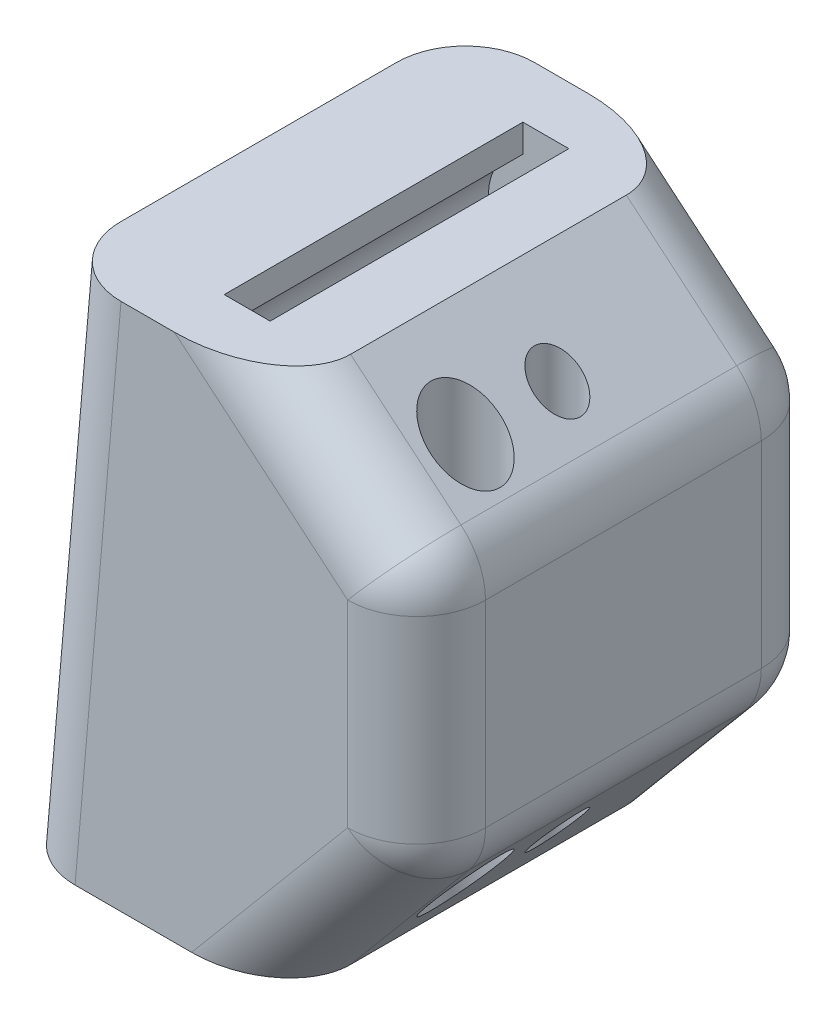
ISO-10303-21;
HEADER;
FILE_DESCRIPTION(('STEP AP214'),'2;1');
FILE_NAME('part.step','',(''),(''),'','','');
FILE_SCHEMA(('AUTOMOTIVE_DESIGN { 1 0 10303 214 1 1 1 1 }'));
ENDSEC;
DATA;
#1=APPLICATION_CONTEXT('core data for automotive mechanical design processes');
#2=APPLICATION_PROTOCOL_DEFINITION('international standard','automotive_design',2000,#1);
#3=PRODUCT_CONTEXT('',#1,'mechanical');
#4=PRODUCT('Part','Part','',(#3));
#5=PRODUCT_RELATED_PRODUCT_CATEGORY('part','',(#4));
#6=PRODUCT_DEFINITION_FORMATION('','',#4);
#7=PRODUCT_DEFINITION_CONTEXT('part definition',#1,'design');
#8=PRODUCT_DEFINITION('design','',#6,#7);
#9=PRODUCT_DEFINITION_SHAPE('','',#8);
#10=(LENGTH_UNIT() NAMED_UNIT(*) SI_UNIT(.MILLI.,.METRE.));
#11=(NAMED_UNIT(*) PLANE_ANGLE_UNIT() SI_UNIT($,.RADIAN.));
#12=(NAMED_UNIT(*) SI_UNIT($,.STERADIAN.) SOLID_ANGLE_UNIT());
#13=UNCERTAINTY_MEASURE_WITH_UNIT(LENGTH_MEASURE(1.E-05),#10,'distance_accuracy_value','');
#14=(GEOMETRIC_REPRESENTATION_CONTEXT(3) GLOBAL_UNCERTAINTY_ASSIGNED_CONTEXT((#13)) GLOBAL_UNIT_ASSIGNED_CONTEXT((#10,
#11,#12)) REPRESENTATION_CONTEXT('',''));
#15=CARTESIAN_POINT('',(0.,0.,0.));
#16=DIRECTION('',(0.,0.,1.));
#17=DIRECTION('',(1.,0.,0.));
#18=AXIS2_PLACEMENT_3D('',#15,#16,#17);
#19=CARTESIAN_POINT('',(0.,0.,18.));
#20=DIRECTION('',(0.,1.,0.));
#21=DIRECTION('',(0.,0.,1.));
#22=AXIS2_PLACEMENT_3D('',#19,#20,#21);
#23=PLANE('',#22);
#24=DIRECTION('',(1.,0.,0.));
#25=VECTOR('',#24,1.);
#26=CARTESIAN_POINT('',(0.,0.,0.));
#27=LINE('',#26,#25);
#28=CARTESIAN_POINT('',(3.0113207949431,0.,0.));
#29=VERTEX_POINT('',#28);
#30=CARTESIAN_POINT('',(8.08377813200317,0.,0.));
#31=VERTEX_POINT('',#30);
#32=EDGE_CURVE('E286',#29,#31,#27,.T.);
#33=ORIENTED_EDGE('',*,*,#32,.T.);
#34=CARTESIAN_POINT('',(8.08377813200317,0.,3.));
#35=DIRECTION('',(0.,1.,0.));
#36=DIRECTION('',(-1.,0.,0.));
#37=AXIS2_PLACEMENT_3D('',#34,#35,#36);
#38=ELLIPSE('',#37,3.91622186799683,3.);
#39=CARTESIAN_POINT('',(12.,0.,3.));
#40=VERTEX_POINT('',#39);
#41=EDGE_CURVE('E382',#31,#40,#38,.F.);
#42=ORIENTED_EDGE('',*,*,#41,.T.);
#43=DIRECTION('',(0.,0.,-1.));
#44=VECTOR('',#43,1.);
#45=CARTESIAN_POINT('',(12.,0.,18.));
#46=LINE('',#45,#44);
#47=CARTESIAN_POINT('',(12.,0.,15.));
#48=VERTEX_POINT('',#47);
#49=EDGE_CURVE('E336',#48,#40,#46,.T.);
#50=ORIENTED_EDGE('',*,*,#49,.F.);
#51=CARTESIAN_POINT('',(8.08377813200318,0.,15.));
#52=DIRECTION('',(0.,1.,0.));
#53=DIRECTION('',(1.,0.,0.));
#54=AXIS2_PLACEMENT_3D('',#51,#52,#53);
#55=ELLIPSE('',#54,3.91622186799683,3.);
#56=CARTESIAN_POINT('',(8.08377813200317,0.,18.));
#57=VERTEX_POINT('',#56);
#58=EDGE_CURVE('E379',#48,#57,#55,.F.);
#59=ORIENTED_EDGE('',*,*,#58,.T.);
#60=DIRECTION('',(1.,0.,0.));
#61=VECTOR('',#60,1.);
#62=CARTESIAN_POINT('',(0.,0.,18.));
#63=LINE('',#62,#61);
#64=CARTESIAN_POINT('',(3.01132079494309,0.,18.));
#65=VERTEX_POINT('',#64);
#66=EDGE_CURVE('E297',#65,#57,#63,.T.);
#67=ORIENTED_EDGE('',*,*,#66,.F.);
#68=CARTESIAN_POINT('',(3.01132079494309,0.,15.));
#69=DIRECTION('',(0.,1.,0.));
#70=DIRECTION('',(-1.,0.,0.));
#71=AXIS2_PLACEMENT_3D('',#68,#69,#70);
#72=ELLIPSE('',#71,3.01132079494309,3.);
#73=CARTESIAN_POINT('',(0.,0.,15.));
#74=VERTEX_POINT('',#73);
#75=EDGE_CURVE('E373',#65,#74,#72,.F.);
#76=ORIENTED_EDGE('',*,*,#75,.T.);
#77=DIRECTION('',(0.,0.,-1.));
#78=VECTOR('',#77,1.);
#79=CARTESIAN_POINT('',(0.,0.,18.));
#80=LINE('',#79,#78);
#81=CARTESIAN_POINT('',(0.,0.,3.));
#82=VERTEX_POINT('',#81);
#83=EDGE_CURVE('E340',#74,#82,#80,.T.);
#84=ORIENTED_EDGE('',*,*,#83,.T.);
#85=CARTESIAN_POINT('',(3.01132079494309,0.,3.));
#86=DIRECTION('',(0.,1.,0.));
#87=DIRECTION('',(1.,0.,0.));
#88=AXIS2_PLACEMENT_3D('',#85,#86,#87);
#89=ELLIPSE('',#88,3.01132079494309,3.);
#90=EDGE_CURVE('E376',#82,#29,#89,.F.);
#91=ORIENTED_EDGE('',*,*,#90,.T.);
#92=EDGE_LOOP('',(#33,#42,#50,#59,#67,#76,#84,#91));
#93=FACE_BOUND('',#92,.T.);
#94=DIRECTION('',(-1.,0.,0.));
#95=VECTOR('',#94,1.);
#96=CARTESIAN_POINT('',(9.,0.,15.5));
#97=LINE('',#96,#95);
#98=CARTESIAN_POINT('',(9.,0.,15.5));
#99=VERTEX_POINT('',#98);
#100=CARTESIAN_POINT('',(7.,0.,15.5));
#101=VERTEX_POINT('',#100);
#102=EDGE_CURVE('E215',#99,#101,#97,.T.);
#103=ORIENTED_EDGE('',*,*,#102,.F.);
#104=DIRECTION('',(0.,0.,-1.));
#105=VECTOR('',#104,1.);
#106=CARTESIAN_POINT('',(9.,0.,15.5));
#107=LINE('',#106,#105);
#108=CARTESIAN_POINT('',(9.,0.,2.5));
#109=VERTEX_POINT('',#108);
#110=EDGE_CURVE('E205',#99,#109,#107,.T.);
#111=ORIENTED_EDGE('',*,*,#110,.T.);
#112=DIRECTION('',(-1.,0.,0.));
#113=VECTOR('',#112,1.);
#114=CARTESIAN_POINT('',(9.,0.,2.5));
#115=LINE('',#114,#113);
#116=CARTESIAN_POINT('',(7.,0.,2.5));
#117=VERTEX_POINT('',#116);
#118=EDGE_CURVE('E224',#109,#117,#115,.T.);
#119=ORIENTED_EDGE('',*,*,#118,.T.);
#120=DIRECTION('',(0.,0.,-1.));
#121=VECTOR('',#120,1.);
#122=CARTESIAN_POINT('',(7.,0.,15.5));
#123=LINE('',#122,#121);
#124=EDGE_CURVE('E246',#101,#117,#123,.T.);
#125=ORIENTED_EDGE('',*,*,#124,.F.);
#126=EDGE_LOOP('',(#103,#111,#119,#125));
#127=FACE_BOUND('',#126,.T.);
#128=ADVANCED_FACE('F39',(#93,#127),#23,.F.);
#129=CARTESIAN_POINT('',(2.,23.,18.));
#130=DIRECTION('',(0.,-1.,0.));
#131=DIRECTION('',(0.,0.,-1.));
#132=AXIS2_PLACEMENT_3D('',#129,#130,#131);
#133=PLANE('',#132);
#134=DIRECTION('',(0.,0.,-1.));
#135=VECTOR('',#134,1.);
#136=CARTESIAN_POINT('',(12.,23.,18.));
#137=LINE('',#136,#135);
#138=CARTESIAN_POINT('',(12.,23.,15.));
#139=VERTEX_POINT('',#138);
#140=CARTESIAN_POINT('',(12.,23.,3.));
#141=VERTEX_POINT('',#140);
#142=EDGE_CURVE('E316',#139,#141,#137,.T.);
#143=ORIENTED_EDGE('',*,*,#142,.T.);
#144=CARTESIAN_POINT('',(7.33282851941877,23.,3.));
#145=DIRECTION('',(0.,-1.,0.));
#146=DIRECTION('',(1.,0.,0.));
#147=AXIS2_PLACEMENT_3D('',#144,#145,#146);
#148=ELLIPSE('',#147,4.66717148058123,3.);
#149=CARTESIAN_POINT('',(7.33282851941877,23.,0.));
#150=VERTEX_POINT('',#149);
#151=EDGE_CURVE('E406',#141,#150,#148,.F.);
#152=ORIENTED_EDGE('',*,*,#151,.T.);
#153=DIRECTION('',(-1.,0.,0.));
#154=VECTOR('',#153,1.);
#155=CARTESIAN_POINT('',(2.,23.,0.));
#156=LINE('',#155,#154);
#157=CARTESIAN_POINT('',(5.01132079494309,23.,0.));
#158=VERTEX_POINT('',#157);
#159=EDGE_CURVE('E302',#150,#158,#156,.T.);
#160=ORIENTED_EDGE('',*,*,#159,.T.);
#161=CARTESIAN_POINT('',(5.01132079494309,23.,3.));
#162=DIRECTION('',(0.,-1.,0.));
#163=DIRECTION('',(1.,0.,0.));
#164=AXIS2_PLACEMENT_3D('',#161,#162,#163);
#165=ELLIPSE('',#164,3.01132079494309,3.);
#166=CARTESIAN_POINT('',(2.,23.,3.));
#167=VERTEX_POINT('',#166);
#168=EDGE_CURVE('E400',#158,#167,#165,.F.);
#169=ORIENTED_EDGE('',*,*,#168,.T.);
#170=DIRECTION('',(0.,0.,-1.));
#171=VECTOR('',#170,1.);
#172=CARTESIAN_POINT('',(2.,23.,18.));
#173=LINE('',#172,#171);
#174=CARTESIAN_POINT('',(2.,23.,15.));
#175=VERTEX_POINT('',#174);
#176=EDGE_CURVE('E306',#175,#167,#173,.T.);
#177=ORIENTED_EDGE('',*,*,#176,.F.);
#178=CARTESIAN_POINT('',(5.01132079494309,23.,15.));
#179=DIRECTION('',(0.,-1.,0.));
#180=DIRECTION('',(-1.,0.,0.));
#181=AXIS2_PLACEMENT_3D('',#178,#179,#180);
#182=ELLIPSE('',#181,3.01132079494309,3.);
#183=CARTESIAN_POINT('',(5.01132079494309,23.,18.));
#184=VERTEX_POINT('',#183);
#185=EDGE_CURVE('E397',#175,#184,#182,.F.);
#186=ORIENTED_EDGE('',*,*,#185,.T.);
#187=DIRECTION('',(-1.,0.,0.));
#188=VECTOR('',#187,1.);
#189=CARTESIAN_POINT('',(2.,23.,18.));
#190=LINE('',#189,#188);
#191=CARTESIAN_POINT('',(7.33282851941877,23.,18.));
#192=VERTEX_POINT('',#191);
#193=EDGE_CURVE('E301',#192,#184,#190,.T.);
#194=ORIENTED_EDGE('',*,*,#193,.F.);
#195=CARTESIAN_POINT('',(7.33282851941877,23.,15.));
#196=DIRECTION('',(0.,-1.,0.));
#197=DIRECTION('',(-1.,0.,0.));
#198=AXIS2_PLACEMENT_3D('',#195,#196,#197);
#199=ELLIPSE('',#198,4.66717148058123,3.);
#200=EDGE_CURVE('E403',#192,#139,#199,.F.);
#201=ORIENTED_EDGE('',*,*,#200,.T.);
#202=EDGE_LOOP('',(#143,#152,#160,#169,#177,#186,#194,#201));
#203=FACE_BOUND('',#202,.T.);
#204=DIRECTION('',(-1.,0.,0.));
#205=VECTOR('',#204,1.);
#206=CARTESIAN_POINT('',(7.,23.,2.5));
#207=LINE('',#206,#205);
#208=CARTESIAN_POINT('',(9.,23.,2.5));
#209=VERTEX_POINT('',#208);
#210=CARTESIAN_POINT('',(7.,23.,2.5));
#211=VERTEX_POINT('',#210);
#212=EDGE_CURVE('E261',#209,#211,#207,.T.);
#213=ORIENTED_EDGE('',*,*,#212,.F.);
#214=DIRECTION('',(0.,0.,1.));
#215=VECTOR('',#214,1.);
#216=CARTESIAN_POINT('',(9.,23.,2.5));
#217=LINE('',#216,#215);
#218=CARTESIAN_POINT('',(9.,23.,15.5));
#219=VERTEX_POINT('',#218);
#220=EDGE_CURVE('E291',#209,#219,#217,.T.);
#221=ORIENTED_EDGE('',*,*,#220,.T.);
#222=DIRECTION('',(-1.,0.,0.));
#223=VECTOR('',#222,1.);
#224=CARTESIAN_POINT('',(7.,23.,15.5));
#225=LINE('',#224,#223);
#226=CARTESIAN_POINT('',(7.,23.,15.5));
#227=VERTEX_POINT('',#226);
#228=EDGE_CURVE('E276',#219,#227,#225,.T.);
#229=ORIENTED_EDGE('',*,*,#228,.T.);
#230=DIRECTION('',(0.,0.,1.));
#231=VECTOR('',#230,1.);
#232=CARTESIAN_POINT('',(7.,23.,2.5));
#233=LINE('',#232,#231);
#234=EDGE_CURVE('E287',#211,#227,#233,.T.);
#235=ORIENTED_EDGE('',*,*,#234,.F.);
#236=EDGE_LOOP('',(#213,#221,#229,#235));
#237=FACE_BOUND('',#236,.T.);
#238=ADVANCED_FACE('F474',(#203,#237),#133,.F.);
#239=CARTESIAN_POINT('',(0.,0.,18.));
#240=DIRECTION('',(0.996240588195683,-0.0866296163648419,0.));
#241=DIRECTION('',(0.0866296163648419,0.996240588195683,0.));
#242=AXIS2_PLACEMENT_3D('',#239,#240,#241);
#243=PLANE('',#242);
#244=ORIENTED_EDGE('',*,*,#176,.T.);
#245=DIRECTION('',(-0.0866296163648419,-0.996240588195683,0.));
#246=VECTOR('',#245,1.);
#247=CARTESIAN_POINT('',(0.,0.,3.));
#248=LINE('',#247,#246);
#249=EDGE_CURVE('E430',#167,#82,#248,.T.);
#250=ORIENTED_EDGE('',*,*,#249,.T.);
#251=ORIENTED_EDGE('',*,*,#83,.F.);
#252=DIRECTION('',(-0.0866296163648419,-0.996240588195683,0.));
#253=VECTOR('',#252,1.);
#254=CARTESIAN_POINT('',(0.,0.,15.));
#255=LINE('',#254,#253);
#256=EDGE_CURVE('E427',#74,#175,#255,.F.);
#257=ORIENTED_EDGE('',*,*,#256,.T.);
#258=EDGE_LOOP('',(#244,#250,#251,#257));
#259=FACE_BOUND('',#258,.T.);
#260=ADVANCED_FACE('F508',(#259),#243,.F.);
#261=CARTESIAN_POINT('',(12.,0.,18.));
#262=DIRECTION('',(-0.76604444311898,0.642787609686537,0.));
#263=DIRECTION('',(-0.642787609686537,-0.76604444311898,0.));
#264=AXIS2_PLACEMENT_3D('',#261,#262,#263);
#265=PLANE('',#264);
#266=CARTESIAN_POINT('',(15.,3.57526077778265,9.));
#267=DIRECTION('',(-0.76604444311898,0.642787609686537,0.));
#268=DIRECTION('',(-0.642787609686537,-0.76604444311898,0.));
#269=AXIS2_PLACEMENT_3D('',#266,#267,#268);
#270=ELLIPSE('',#269,1.55572382686042,1.);
#271=CARTESIAN_POINT('',(14.,2.38350718518843,9.));
#272=VERTEX_POINT('',#271);
#273=EDGE_CURVE('E227',#272,#272,#270,.F.);
#274=ORIENTED_EDGE('',*,*,#273,.F.);
#275=EDGE_LOOP('',(#274));
#276=FACE_BOUND('',#275,.T.);
#277=CARTESIAN_POINT('',(15.,3.57526077778265,13.));
#278=DIRECTION('',(-0.76604444311898,0.642787609686537,0.));
#279=DIRECTION('',(-0.642787609686537,-0.76604444311898,0.));
#280=AXIS2_PLACEMENT_3D('',#277,#278,#279);
#281=ELLIPSE('',#280,2.33358574029063,1.5);
#282=CARTESIAN_POINT('',(13.5,1.78763038889132,13.));
#283=VERTEX_POINT('',#282);
#284=EDGE_CURVE('E349',#283,#283,#281,.F.);
#285=ORIENTED_EDGE('',*,*,#284,.F.);
#286=EDGE_LOOP('',(#285));
#287=FACE_BOUND('',#286,.T.);
#288=ORIENTED_EDGE('',*,*,#49,.T.);
#289=DIRECTION('',(0.642787609686537,0.76604444311898,0.));
#290=VECTOR('',#289,1.);
#291=CARTESIAN_POINT('',(17.1718307475979,6.16354787373898,3.));
#292=LINE('',#291,#290);
#293=CARTESIAN_POINT('',(17.1718307475979,6.16354787373898,3.));
#294=VERTEX_POINT('',#293);
#295=EDGE_CURVE('E357',#40,#294,#292,.T.);
#296=ORIENTED_EDGE('',*,*,#295,.T.);
#297=DIRECTION('',(0.,0.,-1.));
#298=VECTOR('',#297,1.);
#299=CARTESIAN_POINT('',(17.1718307475979,6.16354787373898,18.));
#300=LINE('',#299,#298);
#301=CARTESIAN_POINT('',(17.1718307475979,6.16354787373898,15.));
#302=VERTEX_POINT('',#301);
#303=EDGE_CURVE('E332',#302,#294,#300,.T.);
#304=ORIENTED_EDGE('',*,*,#303,.F.);
#305=DIRECTION('',(0.642787609686537,0.76604444311898,0.));
#306=VECTOR('',#305,1.);
#307=CARTESIAN_POINT('',(12.,0.,15.));
#308=LINE('',#307,#306);
#309=EDGE_CURVE('E344',#302,#48,#308,.F.);
#310=ORIENTED_EDGE('',*,*,#309,.T.);
#311=EDGE_LOOP('',(#288,#296,#304,#310));
#312=FACE_BOUND('',#311,.T.);
#313=ADVANCED_FACE('F512',(#276,#287,#312),#265,.F.);
#314=CARTESIAN_POINT('',(14.8736974182409,8.0919107027986,18.));
#315=DIRECTION('',(0.,0.,-1.));
#316=DIRECTION('',(-1.,0.,0.));
#317=AXIS2_PLACEMENT_3D('',#314,#315,#316);
#318=CYLINDRICAL_SURFACE('',#317,3.);
#319=ORIENTED_EDGE('',*,*,#303,.T.);
#320=CARTESIAN_POINT('',(14.8736974182409,8.0919107027986,3.));
#321=DIRECTION('',(0.,0.,-1.));
#322=DIRECTION('',(-1.,0.,0.));
#323=AXIS2_PLACEMENT_3D('',#320,#321,#322);
#324=CIRCLE('',#323,3.);
#325=CARTESIAN_POINT('',(17.8736974182409,8.0919107027986,3.));
#326=VERTEX_POINT('',#325);
#327=EDGE_CURVE('E388',#294,#326,#324,.F.);
#328=ORIENTED_EDGE('',*,*,#327,.T.);
#329=DIRECTION('',(0.,0.,-1.));
#330=VECTOR('',#329,1.);
#331=CARTESIAN_POINT('',(17.8736974182409,8.0919107027986,18.));
#332=LINE('',#331,#330);
#333=CARTESIAN_POINT('',(17.8736974182409,8.0919107027986,15.));
#334=VERTEX_POINT('',#333);
#335=EDGE_CURVE('E328',#334,#326,#332,.T.);
#336=ORIENTED_EDGE('',*,*,#335,.F.);
#337=CARTESIAN_POINT('',(14.8736974182409,8.0919107027986,15.));
#338=DIRECTION('',(0.,0.,-1.));
#339=DIRECTION('',(-1.,0.,0.));
#340=AXIS2_PLACEMENT_3D('',#337,#338,#339);
#341=CIRCLE('',#340,3.);
#342=EDGE_CURVE('E385',#334,#302,#341,.T.);
#343=ORIENTED_EDGE('',*,*,#342,.T.);
#344=EDGE_LOOP('',(#319,#328,#336,#343));
#345=FACE_BOUND('',#344,.T.);
#346=ADVANCED_FACE('F764',(#345),#318,.T.);
#347=CARTESIAN_POINT('',(17.8736974182409,16.6724596882421,18.));
#348=DIRECTION('',(-1.,0.,0.));
#349=DIRECTION('',(0.,0.,1.));
#350=AXIS2_PLACEMENT_3D('',#347,#348,#349);
#351=PLANE('',#350);
#352=ORIENTED_EDGE('',*,*,#335,.T.);
#353=DIRECTION('',(0.,1.,0.));
#354=VECTOR('',#353,1.);
#355=CARTESIAN_POINT('',(17.8736974182409,16.6724596882421,3.));
#356=LINE('',#355,#354);
#357=CARTESIAN_POINT('',(17.8736974182409,16.6724596882421,3.));
#358=VERTEX_POINT('',#357);
#359=EDGE_CURVE('E11',#326,#358,#356,.T.);
#360=ORIENTED_EDGE('',*,*,#359,.T.);
#361=DIRECTION('',(0.,0.,-1.));
#362=VECTOR('',#361,1.);
#363=CARTESIAN_POINT('',(17.8736974182409,16.6724596882421,18.));
#364=LINE('',#363,#362);
#365=CARTESIAN_POINT('',(17.8736974182409,16.6724596882421,15.));
#366=VERTEX_POINT('',#365);
#367=EDGE_CURVE('E324',#366,#358,#364,.T.);
#368=ORIENTED_EDGE('',*,*,#367,.F.);
#369=DIRECTION('',(0.,1.,0.));
#370=VECTOR('',#369,1.);
#371=CARTESIAN_POINT('',(17.8736974182409,16.6724596882421,15.));
#372=LINE('',#371,#370);
#373=EDGE_CURVE('E49',#366,#334,#372,.F.);
#374=ORIENTED_EDGE('',*,*,#373,.T.);
#375=EDGE_LOOP('',(#352,#360,#368,#374));
#376=FACE_BOUND('',#375,.T.);
#377=ADVANCED_FACE('F755',(#376),#351,.F.);
#378=CARTESIAN_POINT('',(14.8736974182409,16.6724596882421,18.));
#379=DIRECTION('',(0.,0.,-1.));
#380=DIRECTION('',(-1.,0.,0.));
#381=AXIS2_PLACEMENT_3D('',#378,#379,#380);
#382=CYLINDRICAL_SURFACE('',#381,3.);
#383=ORIENTED_EDGE('',*,*,#367,.T.);
#384=CARTESIAN_POINT('',(14.8736974182409,16.6724596882421,3.));
#385=DIRECTION('',(0.,0.,-1.));
#386=DIRECTION('',(-1.,0.,0.));
#387=AXIS2_PLACEMENT_3D('',#384,#385,#386);
#388=CIRCLE('',#387,3.);
#389=CARTESIAN_POINT('',(16.8020602473005,18.970593017599,3.));
#390=VERTEX_POINT('',#389);
#391=EDGE_CURVE('E412',#358,#390,#388,.F.);
#392=ORIENTED_EDGE('',*,*,#391,.T.);
#393=DIRECTION('',(0.,0.,-1.));
#394=VECTOR('',#393,1.);
#395=CARTESIAN_POINT('',(16.8020602473005,18.970593017599,18.));
#396=LINE('',#395,#394);
#397=CARTESIAN_POINT('',(16.8020602473005,18.970593017599,15.));
#398=VERTEX_POINT('',#397);
#399=EDGE_CURVE('E320',#398,#390,#396,.T.);
#400=ORIENTED_EDGE('',*,*,#399,.F.);
#401=CARTESIAN_POINT('',(14.8736974182409,16.6724596882421,15.));
#402=DIRECTION('',(0.,0.,-1.));
#403=DIRECTION('',(-1.,0.,0.));
#404=AXIS2_PLACEMENT_3D('',#401,#402,#403);
#405=CIRCLE('',#404,3.);
#406=EDGE_CURVE('E409',#398,#366,#405,.T.);
#407=ORIENTED_EDGE('',*,*,#406,.T.);
#408=EDGE_LOOP('',(#383,#392,#400,#407));
#409=FACE_BOUND('',#408,.T.);
#410=ADVANCED_FACE('F746',(#409),#382,.T.);
#411=CARTESIAN_POINT('',(12.,23.,18.));
#412=DIRECTION('',(-0.64278760968654,-0.766044443118977,0.));
#413=DIRECTION('',(0.766044443118977,-0.64278760968654,0.));
#414=AXIS2_PLACEMENT_3D('',#411,#412,#413);
#415=PLANE('',#414);
#416=CARTESIAN_POINT('',(15.,20.4827011064682,9.));
#417=DIRECTION('',(-0.64278760968654,-0.766044443118977,0.));
#418=DIRECTION('',(0.766044443118977,-0.64278760968654,0.));
#419=AXIS2_PLACEMENT_3D('',#416,#417,#418);
#420=ELLIPSE('',#419,1.30540728933228,1.);
#421=CARTESIAN_POINT('',(16.,19.6436014752909,9.));
#422=VERTEX_POINT('',#421);
#423=EDGE_CURVE('E351',#422,#422,#420,.F.);
#424=ORIENTED_EDGE('',*,*,#423,.F.);
#425=EDGE_LOOP('',(#424));
#426=FACE_BOUND('',#425,.T.);
#427=CARTESIAN_POINT('',(15.,20.4827011064682,13.));
#428=DIRECTION('',(-0.64278760968654,-0.766044443118977,0.));
#429=DIRECTION('',(0.766044443118977,-0.64278760968654,0.));
#430=AXIS2_PLACEMENT_3D('',#427,#428,#429);
#431=ELLIPSE('',#430,1.95811093399842,1.5);
#432=CARTESIAN_POINT('',(16.5,19.2240516597022,13.));
#433=VERTEX_POINT('',#432);
#434=EDGE_CURVE('E345',#433,#433,#431,.F.);
#435=ORIENTED_EDGE('',*,*,#434,.F.);
#436=EDGE_LOOP('',(#435));
#437=FACE_BOUND('',#436,.T.);
#438=ORIENTED_EDGE('',*,*,#399,.T.);
#439=DIRECTION('',(-0.766044443118977,0.64278760968654,0.));
#440=VECTOR('',#439,1.);
#441=CARTESIAN_POINT('',(12.,23.,3.));
#442=LINE('',#441,#440);
#443=EDGE_CURVE('E394',#390,#141,#442,.T.);
#444=ORIENTED_EDGE('',*,*,#443,.T.);
#445=ORIENTED_EDGE('',*,*,#142,.F.);
#446=DIRECTION('',(-0.766044443118977,0.64278760968654,0.));
#447=VECTOR('',#446,1.);
#448=CARTESIAN_POINT('',(12.,23.,15.));
#449=LINE('',#448,#447);
#450=EDGE_CURVE('E391',#139,#398,#449,.F.);
#451=ORIENTED_EDGE('',*,*,#450,.T.);
#452=EDGE_LOOP('',(#438,#444,#445,#451));
#453=FACE_BOUND('',#452,.T.);
#454=ADVANCED_FACE('F738',(#426,#437,#453),#415,.F.);
#455=CARTESIAN_POINT('',(14.8736974182409,16.6724596882421,18.));
#456=DIRECTION('',(0.,0.,-1.));
#457=DIRECTION('',(-1.,0.,0.));
#458=AXIS2_PLACEMENT_3D('',#455,#456,#457);
#459=PLANE('',#458);
#460=ORIENTED_EDGE('',*,*,#193,.T.);
#461=DIRECTION('',(-0.0866296163648419,-0.996240588195683,0.));
#462=VECTOR('',#461,1.);
#463=CARTESIAN_POINT('',(4.53924321924389,17.5711078794592,18.));
#464=LINE('',#463,#462);
#465=EDGE_CURVE('E423',#184,#65,#464,.T.);
#466=ORIENTED_EDGE('',*,*,#465,.T.);
#467=ORIENTED_EDGE('',*,*,#66,.T.);
#468=DIRECTION('',(0.642787609686537,0.76604444311898,0.));
#469=VECTOR('',#468,1.);
#470=CARTESIAN_POINT('',(19.0987930012238,13.1271835428724,18.));
#471=LINE('',#470,#469);
#472=CARTESIAN_POINT('',(14.8736974182409,8.0919107027986,18.));
#473=VERTEX_POINT('',#472);
#474=EDGE_CURVE('E420',#57,#473,#471,.T.);
#475=ORIENTED_EDGE('',*,*,#474,.T.);
#476=DIRECTION('',(0.,1.,0.));
#477=VECTOR('',#476,1.);
#478=CARTESIAN_POINT('',(14.8736974182409,16.6724596882421,18.));
#479=LINE('',#478,#477);
#480=CARTESIAN_POINT('',(14.8736974182409,16.6724596882421,18.));
#481=VERTEX_POINT('',#480);
#482=EDGE_CURVE('E57',#473,#481,#479,.T.);
#483=ORIENTED_EDGE('',*,*,#482,.T.);
#484=DIRECTION('',(-0.766044443118977,0.64278760968654,0.));
#485=VECTOR('',#484,1.);
#486=CARTESIAN_POINT('',(14.8736974182409,16.6724596882421,18.));
#487=LINE('',#486,#485);
#488=EDGE_CURVE('E417',#481,#192,#487,.T.);
#489=ORIENTED_EDGE('',*,*,#488,.T.);
#490=EDGE_LOOP('',(#460,#466,#467,#475,#483,#489));
#491=FACE_BOUND('',#490,.T.);
#492=ADVANCED_FACE('F471',(#491),#459,.F.);
#493=CARTESIAN_POINT('',(14.8736974182409,16.6724596882421,0.));
#494=DIRECTION('',(0.,0.,-1.));
#495=DIRECTION('',(-1.,0.,0.));
#496=AXIS2_PLACEMENT_3D('',#493,#494,#495);
#497=PLANE('',#496);
#498=ORIENTED_EDGE('',*,*,#32,.F.);
#499=DIRECTION('',(-0.0866296163648419,-0.996240588195683,0.));
#500=VECTOR('',#499,1.);
#501=CARTESIAN_POINT('',(4.98872176458705,22.7401111509055,0.));
#502=LINE('',#501,#500);
#503=EDGE_CURVE('E370',#29,#158,#502,.F.);
#504=ORIENTED_EDGE('',*,*,#503,.T.);
#505=ORIENTED_EDGE('',*,*,#159,.F.);
#506=DIRECTION('',(-0.766044443118977,0.64278760968654,0.));
#507=VECTOR('',#506,1.);
#508=CARTESIAN_POINT('',(14.8736974182409,16.6724596882421,0.));
#509=LINE('',#508,#507);
#510=CARTESIAN_POINT('',(14.8736974182409,16.6724596882421,0.));
#511=VERTEX_POINT('',#510);
#512=EDGE_CURVE('E364',#150,#511,#509,.F.);
#513=ORIENTED_EDGE('',*,*,#512,.T.);
#514=DIRECTION('',(0.,1.,0.));
#515=VECTOR('',#514,1.);
#516=CARTESIAN_POINT('',(14.8736974182409,8.0919107027986,0.));
#517=LINE('',#516,#515);
#518=CARTESIAN_POINT('',(14.8736974182409,8.0919107027986,0.));
#519=VERTEX_POINT('',#518);
#520=EDGE_CURVE('E361',#511,#519,#517,.F.);
#521=ORIENTED_EDGE('',*,*,#520,.T.);
#522=DIRECTION('',(0.642787609686537,0.76604444311898,0.));
#523=VECTOR('',#522,1.);
#524=CARTESIAN_POINT('',(9.70186667064306,1.92836282905961,0.));
#525=LINE('',#524,#523);
#526=EDGE_CURVE('E367',#519,#31,#525,.F.);
#527=ORIENTED_EDGE('',*,*,#526,.T.);
#528=EDGE_LOOP('',(#498,#504,#505,#513,#521,#527));
#529=FACE_BOUND('',#528,.T.);
#530=ADVANCED_FACE('F717',(#529),#497,.T.);
#531=CARTESIAN_POINT('',(8.,19.5,2.5));
#532=DIRECTION('',(0.,0.,1.));
#533=DIRECTION('',(1.,0.,0.));
#534=AXIS2_PLACEMENT_3D('',#531,#532,#533);
#535=CYLINDRICAL_SURFACE('',#534,2.5);
#536=CARTESIAN_POINT('',(8.,19.5,15.5));
#537=DIRECTION('',(0.,0.,1.));
#538=DIRECTION('',(1.,0.,0.));
#539=AXIS2_PLACEMENT_3D('',#536,#537,#538);
#540=CIRCLE('',#539,2.5);
#541=CARTESIAN_POINT('',(7.,21.7912878474779,15.5));
#542=VERTEX_POINT('',#541);
#543=CARTESIAN_POINT('',(9.,21.7912878474779,15.5));
#544=VERTEX_POINT('',#543);
#545=EDGE_CURVE('E245',#542,#544,#540,.T.);
#546=ORIENTED_EDGE('',*,*,#545,.T.);
#547=DIRECTION('',(0.,0.,1.));
#548=VECTOR('',#547,1.);
#549=CARTESIAN_POINT('',(9.,21.7912878474779,2.5));
#550=LINE('',#549,#548);
#551=CARTESIAN_POINT('',(9.,21.7912878474779,2.5));
#552=VERTEX_POINT('',#551);
#553=EDGE_CURVE('E268',#552,#544,#550,.T.);
#554=ORIENTED_EDGE('',*,*,#553,.F.);
#555=CARTESIAN_POINT('',(8.,19.5,2.5));
#556=DIRECTION('',(0.,0.,1.));
#557=DIRECTION('',(1.,0.,0.));
#558=AXIS2_PLACEMENT_3D('',#555,#556,#557);
#559=CIRCLE('',#558,2.5);
#560=CARTESIAN_POINT('',(7.,21.7912878474779,2.5));
#561=VERTEX_POINT('',#560);
#562=EDGE_CURVE('E252',#561,#552,#559,.T.);
#563=ORIENTED_EDGE('',*,*,#562,.F.);
#564=DIRECTION('',(0.,0.,1.));
#565=VECTOR('',#564,1.);
#566=CARTESIAN_POINT('',(7.,21.7912878474779,2.5));
#567=LINE('',#566,#565);
#568=EDGE_CURVE('E283',#561,#542,#567,.T.);
#569=ORIENTED_EDGE('',*,*,#568,.T.);
#570=EDGE_LOOP('',(#546,#554,#563,#569));
#571=FACE_BOUND('',#570,.T.);
#572=ADVANCED_FACE('F708',(#571),#535,.F.);
#573=CARTESIAN_POINT('',(7.,23.,2.5));
#574=DIRECTION('',(-1.,0.,0.));
#575=DIRECTION('',(0.,0.,1.));
#576=AXIS2_PLACEMENT_3D('',#573,#574,#575);
#577=PLANE('',#576);
#578=DIRECTION('',(0.,-1.,0.));
#579=VECTOR('',#578,1.);
#580=CARTESIAN_POINT('',(7.,23.,15.5));
#581=LINE('',#580,#579);
#582=EDGE_CURVE('E257',#227,#542,#581,.T.);
#583=ORIENTED_EDGE('',*,*,#582,.T.);
#584=ORIENTED_EDGE('',*,*,#568,.F.);
#585=DIRECTION('',(0.,-1.,0.));
#586=VECTOR('',#585,1.);
#587=CARTESIAN_POINT('',(7.,23.,2.5));
#588=LINE('',#587,#586);
#589=EDGE_CURVE('E264',#211,#561,#588,.T.);
#590=ORIENTED_EDGE('',*,*,#589,.F.);
#591=ORIENTED_EDGE('',*,*,#234,.T.);
#592=EDGE_LOOP('',(#583,#584,#590,#591));
#593=FACE_BOUND('',#592,.T.);
#594=ADVANCED_FACE('F699',(#593),#577,.F.);
#595=CARTESIAN_POINT('',(9.,23.,2.5));
#596=DIRECTION('',(1.,0.,0.));
#597=DIRECTION('',(0.,0.,-1.));
#598=AXIS2_PLACEMENT_3D('',#595,#596,#597);
#599=PLANE('',#598);
#600=DIRECTION('',(0.,1.,0.));
#601=VECTOR('',#600,1.);
#602=CARTESIAN_POINT('',(9.,23.,15.5));
#603=LINE('',#602,#601);
#604=EDGE_CURVE('E272',#544,#219,#603,.T.);
#605=ORIENTED_EDGE('',*,*,#604,.T.);
#606=ORIENTED_EDGE('',*,*,#220,.F.);
#607=DIRECTION('',(0.,1.,0.));
#608=VECTOR('',#607,1.);
#609=CARTESIAN_POINT('',(9.,23.,2.5));
#610=LINE('',#609,#608);
#611=EDGE_CURVE('E256',#552,#209,#610,.T.);
#612=ORIENTED_EDGE('',*,*,#611,.F.);
#613=ORIENTED_EDGE('',*,*,#553,.T.);
#614=EDGE_LOOP('',(#605,#606,#612,#613));
#615=FACE_BOUND('',#614,.T.);
#616=ADVANCED_FACE('F690',(#615),#599,.F.);
#617=CARTESIAN_POINT('',(8.,19.5,2.5));
#618=DIRECTION('',(0.,0.,1.));
#619=DIRECTION('',(1.,0.,0.));
#620=AXIS2_PLACEMENT_3D('',#617,#618,#619);
#621=PLANE('',#620);
#622=ORIENTED_EDGE('',*,*,#562,.T.);
#623=ORIENTED_EDGE('',*,*,#611,.T.);
#624=ORIENTED_EDGE('',*,*,#212,.T.);
#625=ORIENTED_EDGE('',*,*,#589,.T.);
#626=EDGE_LOOP('',(#622,#623,#624,#625));
#627=FACE_BOUND('',#626,.T.);
#628=ADVANCED_FACE('F681',(#627),#621,.T.);
#629=CARTESIAN_POINT('',(8.,19.5,15.5));
#630=DIRECTION('',(0.,0.,1.));
#631=DIRECTION('',(1.,0.,0.));
#632=AXIS2_PLACEMENT_3D('',#629,#630,#631);
#633=PLANE('',#632);
#634=ORIENTED_EDGE('',*,*,#545,.F.);
#635=ORIENTED_EDGE('',*,*,#582,.F.);
#636=ORIENTED_EDGE('',*,*,#228,.F.);
#637=ORIENTED_EDGE('',*,*,#604,.F.);
#638=EDGE_LOOP('',(#634,#635,#636,#637));
#639=FACE_BOUND('',#638,.T.);
#640=ADVANCED_FACE('F668',(#639),#633,.F.);
#641=CARTESIAN_POINT('',(8.,3.5,15.5));
#642=DIRECTION('',(0.,0.,-1.));
#643=DIRECTION('',(-1.,0.,0.));
#644=AXIS2_PLACEMENT_3D('',#641,#642,#643);
#645=CYLINDRICAL_SURFACE('',#644,2.5);
#646=CARTESIAN_POINT('',(8.,3.5,2.5));
#647=DIRECTION('',(0.,0.,-1.));
#648=DIRECTION('',(-1.,0.,0.));
#649=AXIS2_PLACEMENT_3D('',#646,#647,#648);
#650=CIRCLE('',#649,2.5);
#651=CARTESIAN_POINT('',(7.,1.20871215252208,2.5));
#652=VERTEX_POINT('',#651);
#653=CARTESIAN_POINT('',(9.,1.20871215252208,2.5));
#654=VERTEX_POINT('',#653);
#655=EDGE_CURVE('E200',#652,#654,#650,.T.);
#656=ORIENTED_EDGE('',*,*,#655,.T.);
#657=DIRECTION('',(0.,0.,-1.));
#658=VECTOR('',#657,1.);
#659=CARTESIAN_POINT('',(9.,1.20871215252208,15.5));
#660=LINE('',#659,#658);
#661=CARTESIAN_POINT('',(9.,1.20871215252208,15.5));
#662=VERTEX_POINT('',#661);
#663=EDGE_CURVE('E193',#662,#654,#660,.T.);
#664=ORIENTED_EDGE('',*,*,#663,.F.);
#665=CARTESIAN_POINT('',(8.,3.5,15.5));
#666=DIRECTION('',(0.,0.,-1.));
#667=DIRECTION('',(-1.,0.,0.));
#668=AXIS2_PLACEMENT_3D('',#665,#666,#667);
#669=CIRCLE('',#668,2.5);
#670=CARTESIAN_POINT('',(7.,1.20871215252208,15.5));
#671=VERTEX_POINT('',#670);
#672=EDGE_CURVE('E197',#671,#662,#669,.T.);
#673=ORIENTED_EDGE('',*,*,#672,.F.);
#674=DIRECTION('',(0.,0.,-1.));
#675=VECTOR('',#674,1.);
#676=CARTESIAN_POINT('',(7.,1.20871215252208,15.5));
#677=LINE('',#676,#675);
#678=EDGE_CURVE('E242',#671,#652,#677,.T.);
#679=ORIENTED_EDGE('',*,*,#678,.T.);
#680=EDGE_LOOP('',(#656,#664,#673,#679));
#681=FACE_BOUND('',#680,.T.);
#682=ADVANCED_FACE('F195',(#681),#645,.F.);
#683=CARTESIAN_POINT('',(7.,0.,15.5));
#684=DIRECTION('',(-1.,0.,0.));
#685=DIRECTION('',(0.,0.,1.));
#686=AXIS2_PLACEMENT_3D('',#683,#684,#685);
#687=PLANE('',#686);
#688=DIRECTION('',(0.,1.,0.));
#689=VECTOR('',#688,1.);
#690=CARTESIAN_POINT('',(7.,0.,2.5));
#691=LINE('',#690,#689);
#692=EDGE_CURVE('E220',#117,#652,#691,.T.);
#693=ORIENTED_EDGE('',*,*,#692,.T.);
#694=ORIENTED_EDGE('',*,*,#678,.F.);
#695=DIRECTION('',(0.,1.,0.));
#696=VECTOR('',#695,1.);
#697=CARTESIAN_POINT('',(7.,0.,15.5));
#698=LINE('',#697,#696);
#699=EDGE_CURVE('E206',#101,#671,#698,.T.);
#700=ORIENTED_EDGE('',*,*,#699,.F.);
#701=ORIENTED_EDGE('',*,*,#124,.T.);
#702=EDGE_LOOP('',(#693,#694,#700,#701));
#703=FACE_BOUND('',#702,.T.);
#704=ADVANCED_FACE('F652',(#703),#687,.F.);
#705=CARTESIAN_POINT('',(9.,0.,15.5));
#706=DIRECTION('',(1.,0.,0.));
#707=DIRECTION('',(0.,0.,-1.));
#708=AXIS2_PLACEMENT_3D('',#705,#706,#707);
#709=PLANE('',#708);
#710=DIRECTION('',(0.,-1.,0.));
#711=VECTOR('',#710,1.);
#712=CARTESIAN_POINT('',(9.,0.,2.5));
#713=LINE('',#712,#711);
#714=EDGE_CURVE('E236',#654,#109,#713,.T.);
#715=ORIENTED_EDGE('',*,*,#714,.T.);
#716=ORIENTED_EDGE('',*,*,#110,.F.);
#717=DIRECTION('',(0.,-1.,0.));
#718=VECTOR('',#717,1.);
#719=CARTESIAN_POINT('',(9.,0.,15.5));
#720=LINE('',#719,#718);
#721=EDGE_CURVE('E209',#662,#99,#720,.T.);
#722=ORIENTED_EDGE('',*,*,#721,.F.);
#723=ORIENTED_EDGE('',*,*,#663,.T.);
#724=EDGE_LOOP('',(#715,#716,#722,#723));
#725=FACE_BOUND('',#724,.T.);
#726=ADVANCED_FACE('F210',(#725),#709,.F.);
#727=CARTESIAN_POINT('',(8.,3.5,15.5));
#728=DIRECTION('',(0.,0.,-1.));
#729=DIRECTION('',(-1.,0.,0.));
#730=AXIS2_PLACEMENT_3D('',#727,#728,#729);
#731=PLANE('',#730);
#732=ORIENTED_EDGE('',*,*,#672,.T.);
#733=ORIENTED_EDGE('',*,*,#721,.T.);
#734=ORIENTED_EDGE('',*,*,#102,.T.);
#735=ORIENTED_EDGE('',*,*,#699,.T.);
#736=EDGE_LOOP('',(#732,#733,#734,#735));
#737=FACE_BOUND('',#736,.T.);
#738=ADVANCED_FACE('F217',(#737),#731,.T.);
#739=CARTESIAN_POINT('',(8.,3.5,2.5));
#740=DIRECTION('',(0.,0.,-1.));
#741=DIRECTION('',(-1.,0.,0.));
#742=AXIS2_PLACEMENT_3D('',#739,#740,#741);
#743=PLANE('',#742);
#744=ORIENTED_EDGE('',*,*,#655,.F.);
#745=ORIENTED_EDGE('',*,*,#692,.F.);
#746=ORIENTED_EDGE('',*,*,#118,.F.);
#747=ORIENTED_EDGE('',*,*,#714,.F.);
#748=EDGE_LOOP('',(#744,#745,#746,#747));
#749=FACE_BOUND('',#748,.T.);
#750=ADVANCED_FACE('F628',(#749),#743,.F.);
#751=CARTESIAN_POINT('',(15.,25.,13.));
#752=DIRECTION('',(0.,-1.,0.));
#753=DIRECTION('',(0.,0.,-1.));
#754=AXIS2_PLACEMENT_3D('',#751,#752,#753);
#755=CYLINDRICAL_SURFACE('',#754,1.5);
#756=ORIENTED_EDGE('',*,*,#434,.T.);
#757=EDGE_LOOP('',(#756));
#758=FACE_BOUND('',#757,.T.);
#759=ORIENTED_EDGE('',*,*,#284,.T.);
#760=EDGE_LOOP('',(#759));
#761=FACE_BOUND('',#760,.T.);
#762=ADVANCED_FACE('F619',(#758,#761),#755,.F.);
#763=CARTESIAN_POINT('',(15.,25.,9.));
#764=DIRECTION('',(0.,-1.,0.));
#765=DIRECTION('',(0.,0.,-1.));
#766=AXIS2_PLACEMENT_3D('',#763,#764,#765);
#767=CYLINDRICAL_SURFACE('',#766,1.);
#768=ORIENTED_EDGE('',*,*,#423,.T.);
#769=EDGE_LOOP('',(#768));
#770=FACE_BOUND('',#769,.T.);
#771=ORIENTED_EDGE('',*,*,#273,.T.);
#772=EDGE_LOOP('',(#771));
#773=FACE_BOUND('',#772,.T.);
#774=ADVANCED_FACE('F536',(#770,#773),#767,.F.);
#775=CARTESIAN_POINT('',(10.0716371709404,20.7018666706431,3.));
#776=DIRECTION('',(0.766044443118977,-0.64278760968654,0.));
#777=DIRECTION('',(0.64278760968654,0.766044443118977,0.));
#778=AXIS2_PLACEMENT_3D('',#775,#776,#777);
#779=CYLINDRICAL_SURFACE('',#778,3.);
#780=ORIENTED_EDGE('',*,*,#151,.F.);
#781=ORIENTED_EDGE('',*,*,#443,.F.);
#782=CARTESIAN_POINT('',(14.8736974182409,16.6724596882421,3.));
#783=DIRECTION('',(0.766044443118977,-0.64278760968654,0.));
#784=DIRECTION('',(0.64278760968654,0.766044443118977,0.));
#785=AXIS2_PLACEMENT_3D('',#782,#783,#784);
#786=CIRCLE('',#785,3.);
#787=EDGE_CURVE('E350',#511,#390,#786,.T.);
#788=ORIENTED_EDGE('',*,*,#787,.F.);
#789=ORIENTED_EDGE('',*,*,#512,.F.);
#790=EDGE_LOOP('',(#780,#781,#788,#789));
#791=FACE_BOUND('',#790,.T.);
#792=ADVANCED_FACE('F532',(#791),#779,.T.);
#793=CARTESIAN_POINT('',(14.8736974182409,16.6724596882421,3.));
#794=DIRECTION('',(0.,0.,-1.));
#795=DIRECTION('',(-1.,0.,0.));
#796=AXIS2_PLACEMENT_3D('',#793,#794,#795);
#797=SPHERICAL_SURFACE('',#796,3.);
#798=ORIENTED_EDGE('',*,*,#787,.T.);
#799=ORIENTED_EDGE('',*,*,#391,.F.);
#800=CARTESIAN_POINT('',(14.8736974182409,16.6724596882421,3.));
#801=DIRECTION('',(0.,-1.,0.));
#802=DIRECTION('',(1.,0.,0.));
#803=AXIS2_PLACEMENT_3D('',#800,#801,#802);
#804=CIRCLE('',#803,3.);
#805=EDGE_CURVE('E443',#511,#358,#804,.T.);
#806=ORIENTED_EDGE('',*,*,#805,.F.);
#807=EDGE_LOOP('',(#798,#799,#806));
#808=FACE_BOUND('',#807,.T.);
#809=ADVANCED_FACE('F528',(#808),#797,.T.);
#810=CARTESIAN_POINT('',(14.8736974182409,16.6724596882421,3.));
#811=DIRECTION('',(0.,-1.,0.));
#812=DIRECTION('',(0.,0.,-1.));
#813=AXIS2_PLACEMENT_3D('',#810,#811,#812);
#814=CYLINDRICAL_SURFACE('',#813,3.);
#815=ORIENTED_EDGE('',*,*,#805,.T.);
#816=ORIENTED_EDGE('',*,*,#359,.F.);
#817=CARTESIAN_POINT('',(14.8736974182409,8.0919107027986,3.));
#818=DIRECTION('',(0.,-1.,0.));
#819=DIRECTION('',(0.,0.,-1.));
#820=AXIS2_PLACEMENT_3D('',#817,#818,#819);
#821=CIRCLE('',#820,3.);
#822=EDGE_CURVE('E439',#519,#326,#821,.T.);
#823=ORIENTED_EDGE('',*,*,#822,.F.);
#824=ORIENTED_EDGE('',*,*,#520,.F.);
#825=EDGE_LOOP('',(#815,#816,#823,#824));
#826=FACE_BOUND('',#825,.T.);
#827=ADVANCED_FACE('F524',(#826),#814,.T.);
#828=CARTESIAN_POINT('',(14.8736974182409,8.0919107027986,3.));
#829=DIRECTION('',(0.,0.,-1.));
#830=DIRECTION('',(-1.,0.,0.));
#831=AXIS2_PLACEMENT_3D('',#828,#829,#830);
#832=SPHERICAL_SURFACE('',#831,3.);
#833=ORIENTED_EDGE('',*,*,#822,.T.);
#834=ORIENTED_EDGE('',*,*,#327,.F.);
#835=CARTESIAN_POINT('',(14.8736974182409,8.0919107027986,3.));
#836=DIRECTION('',(-0.64278760968654,-0.766044443118977,0.));
#837=DIRECTION('',(0.766044443118977,-0.64278760968654,0.));
#838=AXIS2_PLACEMENT_3D('',#835,#836,#837);
#839=CIRCLE('',#838,3.);
#840=EDGE_CURVE('E436',#519,#294,#839,.T.);
#841=ORIENTED_EDGE('',*,*,#840,.F.);
#842=EDGE_LOOP('',(#833,#834,#841));
#843=FACE_BOUND('',#842,.T.);
#844=ADVANCED_FACE('F520',(#843),#832,.T.);
#845=CARTESIAN_POINT('',(9.70186667064306,1.92836282905961,3.));
#846=DIRECTION('',(-0.642787609686537,-0.76604444311898,0.));
#847=DIRECTION('',(0.76604444311898,-0.642787609686537,0.));
#848=AXIS2_PLACEMENT_3D('',#845,#846,#847);
#849=CYLINDRICAL_SURFACE('',#848,3.);
#850=ORIENTED_EDGE('',*,*,#41,.F.);
#851=ORIENTED_EDGE('',*,*,#526,.F.);
#852=ORIENTED_EDGE('',*,*,#840,.T.);
#853=ORIENTED_EDGE('',*,*,#295,.F.);
#854=EDGE_LOOP('',(#850,#851,#852,#853));
#855=FACE_BOUND('',#854,.T.);
#856=ADVANCED_FACE('F517',(#855),#849,.T.);
#857=CARTESIAN_POINT('',(14.8736974182409,16.6724596882421,15.));
#858=DIRECTION('',(-0.766044443118977,0.64278760968654,0.));
#859=DIRECTION('',(-0.64278760968654,-0.766044443118977,0.));
#860=AXIS2_PLACEMENT_3D('',#857,#858,#859);
#861=CYLINDRICAL_SURFACE('',#860,3.);
#862=CARTESIAN_POINT('',(14.8736974182409,16.6724596882421,15.));
#863=DIRECTION('',(0.766044443118977,-0.64278760968654,0.));
#864=DIRECTION('',(0.64278760968654,0.766044443118977,0.));
#865=AXIS2_PLACEMENT_3D('',#862,#863,#864);
#866=CIRCLE('',#865,3.);
#867=EDGE_CURVE('E43',#398,#481,#866,.T.);
#868=ORIENTED_EDGE('',*,*,#867,.F.);
#869=ORIENTED_EDGE('',*,*,#450,.F.);
#870=ORIENTED_EDGE('',*,*,#200,.F.);
#871=ORIENTED_EDGE('',*,*,#488,.F.);
#872=EDGE_LOOP('',(#868,#869,#870,#871));
#873=FACE_BOUND('',#872,.T.);
#874=ADVANCED_FACE('F468',(#873),#861,.T.);
#875=CARTESIAN_POINT('',(14.8736974182409,16.6724596882421,15.));
#876=DIRECTION('',(0.,0.,-1.));
#877=DIRECTION('',(-1.,0.,0.));
#878=AXIS2_PLACEMENT_3D('',#875,#876,#877);
#879=SPHERICAL_SURFACE('',#878,3.);
#880=ORIENTED_EDGE('',*,*,#406,.F.);
#881=ORIENTED_EDGE('',*,*,#867,.T.);
#882=CARTESIAN_POINT('',(14.8736974182409,16.6724596882421,15.));
#883=DIRECTION('',(0.,-1.,0.));
#884=DIRECTION('',(1.,0.,0.));
#885=AXIS2_PLACEMENT_3D('',#882,#883,#884);
#886=CIRCLE('',#885,3.);
#887=EDGE_CURVE('E454',#366,#481,#886,.T.);
#888=ORIENTED_EDGE('',*,*,#887,.F.);
#889=EDGE_LOOP('',(#880,#881,#888));
#890=FACE_BOUND('',#889,.T.);
#891=ADVANCED_FACE('F465',(#890),#879,.T.);
#892=CARTESIAN_POINT('',(14.8736974182409,16.6724596882421,15.));
#893=DIRECTION('',(0.,1.,0.));
#894=DIRECTION('',(0.,0.,1.));
#895=AXIS2_PLACEMENT_3D('',#892,#893,#894);
#896=CYLINDRICAL_SURFACE('',#895,3.);
#897=CARTESIAN_POINT('',(14.8736974182409,8.0919107027986,15.));
#898=DIRECTION('',(0.,-1.,0.));
#899=DIRECTION('',(0.,0.,-1.));
#900=AXIS2_PLACEMENT_3D('',#897,#898,#899);
#901=CIRCLE('',#900,3.);
#902=EDGE_CURVE('E452',#334,#473,#901,.T.);
#903=ORIENTED_EDGE('',*,*,#902,.F.);
#904=ORIENTED_EDGE('',*,*,#373,.F.);
#905=ORIENTED_EDGE('',*,*,#887,.T.);
#906=ORIENTED_EDGE('',*,*,#482,.F.);
#907=EDGE_LOOP('',(#903,#904,#905,#906));
#908=FACE_BOUND('',#907,.T.);
#909=ADVANCED_FACE('F494',(#908),#896,.T.);
#910=CARTESIAN_POINT('',(14.8736974182409,8.0919107027986,15.));
#911=DIRECTION('',(0.,0.,-1.));
#912=DIRECTION('',(-1.,0.,0.));
#913=AXIS2_PLACEMENT_3D('',#910,#911,#912);
#914=SPHERICAL_SURFACE('',#913,3.);
#915=ORIENTED_EDGE('',*,*,#342,.F.);
#916=ORIENTED_EDGE('',*,*,#902,.T.);
#917=CARTESIAN_POINT('',(14.8736974182409,8.0919107027986,15.));
#918=DIRECTION('',(-0.64278760968654,-0.766044443118977,0.));
#919=DIRECTION('',(0.766044443118977,-0.64278760968654,0.));
#920=AXIS2_PLACEMENT_3D('',#917,#918,#919);
#921=CIRCLE('',#920,3.);
#922=EDGE_CURVE('E65',#302,#473,#921,.T.);
#923=ORIENTED_EDGE('',*,*,#922,.F.);
#924=EDGE_LOOP('',(#915,#916,#923));
#925=FACE_BOUND('',#924,.T.);
#926=ADVANCED_FACE('F492',(#925),#914,.T.);
#927=CARTESIAN_POINT('',(19.0987930012238,13.1271835428724,15.));
#928=DIRECTION('',(0.642787609686537,0.76604444311898,0.));
#929=DIRECTION('',(-0.76604444311898,0.642787609686537,0.));
#930=AXIS2_PLACEMENT_3D('',#927,#928,#929);
#931=CYLINDRICAL_SURFACE('',#930,3.);
#932=ORIENTED_EDGE('',*,*,#58,.F.);
#933=ORIENTED_EDGE('',*,*,#309,.F.);
#934=ORIENTED_EDGE('',*,*,#922,.T.);
#935=ORIENTED_EDGE('',*,*,#474,.F.);
#936=EDGE_LOOP('',(#932,#933,#934,#935));
#937=FACE_BOUND('',#936,.T.);
#938=ADVANCED_FACE('F487',(#937),#931,.T.);
#939=CARTESIAN_POINT('',(2.98872176458705,-0.259888849094526,3.));
#940=DIRECTION('',(0.0866296163648419,0.996240588195683,0.));
#941=DIRECTION('',(-0.996240588195683,0.0866296163648419,0.));
#942=AXIS2_PLACEMENT_3D('',#939,#940,#941);
#943=CYLINDRICAL_SURFACE('',#942,3.);
#944=ORIENTED_EDGE('',*,*,#168,.F.);
#945=ORIENTED_EDGE('',*,*,#503,.F.);
#946=ORIENTED_EDGE('',*,*,#90,.F.);
#947=ORIENTED_EDGE('',*,*,#249,.F.);
#948=EDGE_LOOP('',(#944,#945,#946,#947));
#949=FACE_BOUND('',#948,.T.);
#950=ADVANCED_FACE('F539',(#949),#943,.T.);
#951=CARTESIAN_POINT('',(4.53924321924389,17.5711078794592,15.));
#952=DIRECTION('',(-0.0866296163648419,-0.996240588195683,0.));
#953=DIRECTION('',(0.996240588195683,-0.0866296163648419,0.));
#954=AXIS2_PLACEMENT_3D('',#951,#952,#953);
#955=CYLINDRICAL_SURFACE('',#954,3.);
#956=ORIENTED_EDGE('',*,*,#185,.F.);
#957=ORIENTED_EDGE('',*,*,#256,.F.);
#958=ORIENTED_EDGE('',*,*,#75,.F.);
#959=ORIENTED_EDGE('',*,*,#465,.F.);
#960=EDGE_LOOP('',(#956,#957,#958,#959));
#961=FACE_BOUND('',#960,.T.);
#962=ADVANCED_FACE('F41',(#961),#955,.T.);
#963=CLOSED_SHELL('',(#128,#238,#260,#313,#346,#377,#410,#454,#492,#530,#572,#594,#616,#628,
#640,#682,#704,#726,#738,#750,#762,#774,#792,#809,#827,#844,#856,#874,#891,#909,#926,#938,#950,#962));
#964=MANIFOLD_SOLID_BREP('B2',#963);
#965=ADVANCED_BREP_SHAPE_REPRESENTATION('',(#18,#964),#14);
#966=SHAPE_DEFINITION_REPRESENTATION(#9,#965);
ENDSEC;
END-ISO-10303-21;
